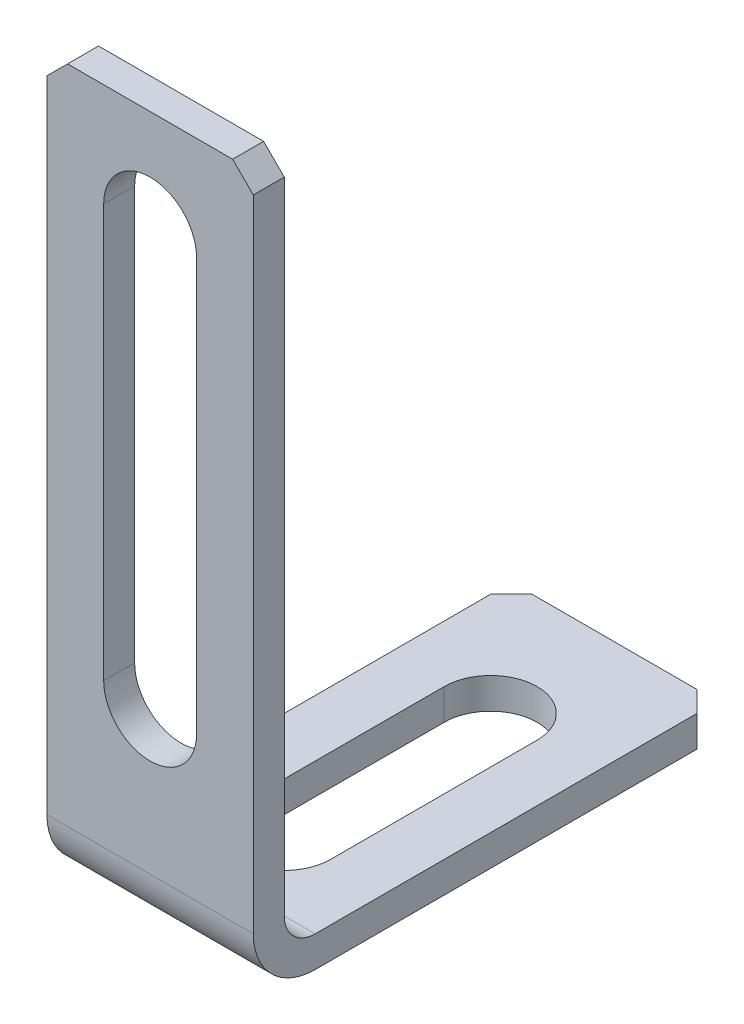
ISO-10303-21;
HEADER;
FILE_DESCRIPTION(('STEP AP214'),'2;1');
FILE_NAME('part.step','',(''),(''),'','','');
FILE_SCHEMA(('AUTOMOTIVE_DESIGN { 1 0 10303 214 1 1 1 1 }'));
ENDSEC;
DATA;
#1=APPLICATION_CONTEXT('core data for automotive mechanical design processes');
#2=APPLICATION_PROTOCOL_DEFINITION('international standard','automotive_design',2000,#1);
#3=PRODUCT_CONTEXT('',#1,'mechanical');
#4=PRODUCT('Part','Part','',(#3));
#5=PRODUCT_RELATED_PRODUCT_CATEGORY('part','',(#4));
#6=PRODUCT_DEFINITION_FORMATION('','',#4);
#7=PRODUCT_DEFINITION_CONTEXT('part definition',#1,'design');
#8=PRODUCT_DEFINITION('design','',#6,#7);
#9=PRODUCT_DEFINITION_SHAPE('','',#8);
#10=(LENGTH_UNIT() NAMED_UNIT(*) SI_UNIT(.MILLI.,.METRE.));
#11=(NAMED_UNIT(*) PLANE_ANGLE_UNIT() SI_UNIT($,.RADIAN.));
#12=(NAMED_UNIT(*) SI_UNIT($,.STERADIAN.) SOLID_ANGLE_UNIT());
#13=UNCERTAINTY_MEASURE_WITH_UNIT(LENGTH_MEASURE(1.E-05),#10,'distance_accuracy_value','');
#14=(GEOMETRIC_REPRESENTATION_CONTEXT(3) GLOBAL_UNCERTAINTY_ASSIGNED_CONTEXT((#13)) GLOBAL_UNIT_ASSIGNED_CONTEXT((#10,
#11,#12)) REPRESENTATION_CONTEXT('',''));
#15=CARTESIAN_POINT('',(0.,0.,0.));
#16=DIRECTION('',(0.,0.,1.));
#17=DIRECTION('',(1.,0.,0.));
#18=AXIS2_PLACEMENT_3D('',#15,#16,#17);
#19=CARTESIAN_POINT('',(0.,70.,-45.));
#20=DIRECTION('',(0.,1.,0.));
#21=DIRECTION('',(0.,0.,1.));
#22=AXIS2_PLACEMENT_3D('',#19,#20,#21);
#23=PLANE('',#22);
#24=DIRECTION('',(-1.,0.,0.));
#25=VECTOR('',#24,1.);
#26=CARTESIAN_POINT('',(20.,70.,-3.));
#27=LINE('',#26,#25);
#28=CARTESIAN_POINT('',(18.,70.,-3.));
#29=VERTEX_POINT('',#28);
#30=CARTESIAN_POINT('',(1.99999999999998,70.,-3.));
#31=VERTEX_POINT('',#30);
#32=EDGE_CURVE('E253',#29,#31,#27,.T.);
#33=ORIENTED_EDGE('',*,*,#32,.T.);
#34=DIRECTION('',(0.,0.,1.));
#35=VECTOR('',#34,1.);
#36=CARTESIAN_POINT('',(1.99999999999998,70.,0.));
#37=LINE('',#36,#35);
#38=CARTESIAN_POINT('',(1.99999999999998,70.,0.));
#39=VERTEX_POINT('',#38);
#40=EDGE_CURVE('E275',#31,#39,#37,.T.);
#41=ORIENTED_EDGE('',*,*,#40,.T.);
#42=DIRECTION('',(1.,0.,0.));
#43=VECTOR('',#42,1.);
#44=CARTESIAN_POINT('',(0.,70.,0.));
#45=LINE('',#44,#43);
#46=CARTESIAN_POINT('',(18.,70.,0.));
#47=VERTEX_POINT('',#46);
#48=EDGE_CURVE('E265',#39,#47,#45,.T.);
#49=ORIENTED_EDGE('',*,*,#48,.T.);
#50=DIRECTION('',(0.,0.,-1.));
#51=VECTOR('',#50,1.);
#52=CARTESIAN_POINT('',(18.,70.,-45.));
#53=LINE('',#52,#51);
#54=EDGE_CURVE('E271',#47,#29,#53,.T.);
#55=ORIENTED_EDGE('',*,*,#54,.T.);
#56=EDGE_LOOP('',(#33,#41,#49,#55));
#57=FACE_BOUND('',#56,.T.);
#58=ADVANCED_FACE('F32',(#57),#23,.T.);
#59=CARTESIAN_POINT('',(0.,0.,-45.));
#60=DIRECTION('',(0.,0.,-1.));
#61=DIRECTION('',(-1.,0.,0.));
#62=AXIS2_PLACEMENT_3D('',#59,#60,#61);
#63=PLANE('',#62);
#64=DIRECTION('',(1.,0.,0.));
#65=VECTOR('',#64,1.);
#66=CARTESIAN_POINT('',(0.,0.,-45.));
#67=LINE('',#66,#65);
#68=CARTESIAN_POINT('',(1.99999999999998,0.,-45.));
#69=VERTEX_POINT('',#68);
#70=CARTESIAN_POINT('',(18.,0.,-45.));
#71=VERTEX_POINT('',#70);
#72=EDGE_CURVE('E268',#69,#71,#67,.T.);
#73=ORIENTED_EDGE('',*,*,#72,.F.);
#74=DIRECTION('',(0.,1.,0.));
#75=VECTOR('',#74,1.);
#76=CARTESIAN_POINT('',(1.99999999999998,3.,-45.));
#77=LINE('',#76,#75);
#78=CARTESIAN_POINT('',(1.99999999999998,3.,-45.));
#79=VERTEX_POINT('',#78);
#80=EDGE_CURVE('E295',#69,#79,#77,.T.);
#81=ORIENTED_EDGE('',*,*,#80,.T.);
#82=DIRECTION('',(-1.,0.,0.));
#83=VECTOR('',#82,1.);
#84=CARTESIAN_POINT('',(20.,3.,-45.));
#85=LINE('',#84,#83);
#86=CARTESIAN_POINT('',(18.,3.,-45.));
#87=VERTEX_POINT('',#86);
#88=EDGE_CURVE('E249',#87,#79,#85,.T.);
#89=ORIENTED_EDGE('',*,*,#88,.F.);
#90=DIRECTION('',(0.,-1.,0.));
#91=VECTOR('',#90,1.);
#92=CARTESIAN_POINT('',(18.,0.,-45.));
#93=LINE('',#92,#91);
#94=EDGE_CURVE('E293',#87,#71,#93,.T.);
#95=ORIENTED_EDGE('',*,*,#94,.T.);
#96=EDGE_LOOP('',(#73,#81,#89,#95));
#97=FACE_BOUND('',#96,.T.);
#98=ADVANCED_FACE('F355',(#97),#63,.T.);
#99=CARTESIAN_POINT('',(0.,0.,0.));
#100=DIRECTION('',(0.,-1.,0.));
#101=DIRECTION('',(0.,0.,-1.));
#102=AXIS2_PLACEMENT_3D('',#99,#100,#101);
#103=PLANE('',#102);
#104=CARTESIAN_POINT('',(10.,0.,-33.));
#105=DIRECTION('',(0.,1.,0.));
#106=DIRECTION('',(0.,0.,1.));
#107=AXIS2_PLACEMENT_3D('',#104,#105,#106);
#108=CIRCLE('',#107,4.5);
#109=CARTESIAN_POINT('',(14.5,0.,-33.));
#110=VERTEX_POINT('',#109);
#111=CARTESIAN_POINT('',(5.5,0.,-33.));
#112=VERTEX_POINT('',#111);
#113=EDGE_CURVE('E211',#110,#112,#108,.T.);
#114=ORIENTED_EDGE('',*,*,#113,.T.);
#115=DIRECTION('',(0.,0.,1.));
#116=VECTOR('',#115,1.);
#117=CARTESIAN_POINT('',(5.5,0.,-33.));
#118=LINE('',#117,#116);
#119=CARTESIAN_POINT('',(5.5,0.,-13.));
#120=VERTEX_POINT('',#119);
#121=EDGE_CURVE('E214',#112,#120,#118,.T.);
#122=ORIENTED_EDGE('',*,*,#121,.T.);
#123=CARTESIAN_POINT('',(10.,0.,-13.));
#124=DIRECTION('',(0.,1.,0.));
#125=DIRECTION('',(0.,0.,1.));
#126=AXIS2_PLACEMENT_3D('',#123,#124,#125);
#127=CIRCLE('',#126,4.5);
#128=CARTESIAN_POINT('',(14.5,0.,-13.));
#129=VERTEX_POINT('',#128);
#130=EDGE_CURVE('E218',#120,#129,#127,.T.);
#131=ORIENTED_EDGE('',*,*,#130,.T.);
#132=DIRECTION('',(0.,0.,-1.));
#133=VECTOR('',#132,1.);
#134=CARTESIAN_POINT('',(14.5,0.,-13.));
#135=LINE('',#134,#133);
#136=EDGE_CURVE('E221',#129,#110,#135,.T.);
#137=ORIENTED_EDGE('',*,*,#136,.T.);
#138=EDGE_LOOP('',(#114,#122,#131,#137));
#139=FACE_BOUND('',#138,.T.);
#140=DIRECTION('',(0.,0.,-1.));
#141=VECTOR('',#140,1.);
#142=CARTESIAN_POINT('',(20.,0.,0.));
#143=LINE('',#142,#141);
#144=CARTESIAN_POINT('',(20.,0.,-6.));
#145=VERTEX_POINT('',#144);
#146=CARTESIAN_POINT('',(20.,0.,-43.));
#147=VERTEX_POINT('',#146);
#148=EDGE_CURVE('E263',#145,#147,#143,.T.);
#149=ORIENTED_EDGE('',*,*,#148,.F.);
#150=DIRECTION('',(1.,0.,0.));
#151=VECTOR('',#150,1.);
#152=CARTESIAN_POINT('',(0.,0.,-6.));
#153=LINE('',#152,#151);
#154=CARTESIAN_POINT('',(0.,0.,-6.));
#155=VERTEX_POINT('',#154);
#156=EDGE_CURVE('E40',#145,#155,#153,.F.);
#157=ORIENTED_EDGE('',*,*,#156,.T.);
#158=DIRECTION('',(0.,0.,-1.));
#159=VECTOR('',#158,1.);
#160=CARTESIAN_POINT('',(0.,0.,0.));
#161=LINE('',#160,#159);
#162=CARTESIAN_POINT('',(0.,0.,-43.));
#163=VERTEX_POINT('',#162);
#164=EDGE_CURVE('E262',#155,#163,#161,.T.);
#165=ORIENTED_EDGE('',*,*,#164,.T.);
#166=DIRECTION('',(0.707106781186544,0.,-0.707106781186551));
#167=VECTOR('',#166,1.);
#168=CARTESIAN_POINT('',(-21.5,0.,-21.4999999999998));
#169=LINE('',#168,#167);
#170=EDGE_CURVE('E305',#163,#69,#169,.T.);
#171=ORIENTED_EDGE('',*,*,#170,.T.);
#172=ORIENTED_EDGE('',*,*,#72,.T.);
#173=DIRECTION('',(-0.70710678118655,0.,-0.707106781186545));
#174=VECTOR('',#173,1.);
#175=CARTESIAN_POINT('',(31.4999999999999,0.,-31.5000000000001));
#176=LINE('',#175,#174);
#177=EDGE_CURVE('E302',#71,#147,#176,.F.);
#178=ORIENTED_EDGE('',*,*,#177,.T.);
#179=EDGE_LOOP('',(#149,#157,#165,#171,#172,#178));
#180=FACE_BOUND('',#179,.T.);
#181=ADVANCED_FACE('F360',(#139,#180),#103,.T.);
#182=CARTESIAN_POINT('',(0.,70.,0.));
#183=DIRECTION('',(0.,0.,1.));
#184=DIRECTION('',(1.,0.,0.));
#185=AXIS2_PLACEMENT_3D('',#182,#183,#184);
#186=PLANE('',#185);
#187=CARTESIAN_POINT('',(10.,60.,0.));
#188=DIRECTION('',(0.,0.,-1.));
#189=DIRECTION('',(-1.,0.,0.));
#190=AXIS2_PLACEMENT_3D('',#187,#188,#189);
#191=CIRCLE('',#190,4.5);
#192=CARTESIAN_POINT('',(5.5,60.,0.));
#193=VERTEX_POINT('',#192);
#194=CARTESIAN_POINT('',(14.5,60.,0.));
#195=VERTEX_POINT('',#194);
#196=EDGE_CURVE('E171',#193,#195,#191,.T.);
#197=ORIENTED_EDGE('',*,*,#196,.T.);
#198=DIRECTION('',(0.,-1.,0.));
#199=VECTOR('',#198,1.);
#200=CARTESIAN_POINT('',(14.5,60.,0.));
#201=LINE('',#200,#199);
#202=CARTESIAN_POINT('',(14.5,20.,0.));
#203=VERTEX_POINT('',#202);
#204=EDGE_CURVE('E183',#195,#203,#201,.T.);
#205=ORIENTED_EDGE('',*,*,#204,.T.);
#206=CARTESIAN_POINT('',(10.,20.,0.));
#207=DIRECTION('',(0.,0.,-1.));
#208=DIRECTION('',(-1.,0.,0.));
#209=AXIS2_PLACEMENT_3D('',#206,#207,#208);
#210=CIRCLE('',#209,4.5);
#211=CARTESIAN_POINT('',(5.5,20.,0.));
#212=VERTEX_POINT('',#211);
#213=EDGE_CURVE('E187',#203,#212,#210,.T.);
#214=ORIENTED_EDGE('',*,*,#213,.T.);
#215=DIRECTION('',(0.,1.,0.));
#216=VECTOR('',#215,1.);
#217=CARTESIAN_POINT('',(5.5,20.,0.));
#218=LINE('',#217,#216);
#219=EDGE_CURVE('E179',#212,#193,#218,.T.);
#220=ORIENTED_EDGE('',*,*,#219,.T.);
#221=EDGE_LOOP('',(#197,#205,#214,#220));
#222=FACE_BOUND('',#221,.T.);
#223=DIRECTION('',(0.,-1.,0.));
#224=VECTOR('',#223,1.);
#225=CARTESIAN_POINT('',(0.,70.,0.));
#226=LINE('',#225,#224);
#227=CARTESIAN_POINT('',(0.,68.,0.));
#228=VERTEX_POINT('',#227);
#229=CARTESIAN_POINT('',(0.,6.00000000000001,0.));
#230=VERTEX_POINT('',#229);
#231=EDGE_CURVE('E259',#228,#230,#226,.T.);
#232=ORIENTED_EDGE('',*,*,#231,.T.);
#233=DIRECTION('',(1.,0.,0.));
#234=VECTOR('',#233,1.);
#235=CARTESIAN_POINT('',(0.,6.00000000000001,0.));
#236=LINE('',#235,#234);
#237=CARTESIAN_POINT('',(20.,6.00000000000001,0.));
#238=VERTEX_POINT('',#237);
#239=EDGE_CURVE('E322',#230,#238,#236,.T.);
#240=ORIENTED_EDGE('',*,*,#239,.T.);
#241=DIRECTION('',(0.,-1.,0.));
#242=VECTOR('',#241,1.);
#243=CARTESIAN_POINT('',(20.,70.,0.));
#244=LINE('',#243,#242);
#245=CARTESIAN_POINT('',(20.,68.,0.));
#246=VERTEX_POINT('',#245);
#247=EDGE_CURVE('E256',#246,#238,#244,.T.);
#248=ORIENTED_EDGE('',*,*,#247,.F.);
#249=DIRECTION('',(0.707106781186555,-0.70710678118654,0.));
#250=VECTOR('',#249,1.);
#251=CARTESIAN_POINT('',(8.9999999999998,79.,0.));
#252=LINE('',#251,#250);
#253=EDGE_CURVE('E278',#246,#47,#252,.F.);
#254=ORIENTED_EDGE('',*,*,#253,.T.);
#255=ORIENTED_EDGE('',*,*,#48,.F.);
#256=DIRECTION('',(-0.707106781186544,-0.707106781186551,0.));
#257=VECTOR('',#256,1.);
#258=CARTESIAN_POINT('',(1.,69.,0.));
#259=LINE('',#258,#257);
#260=EDGE_CURVE('E280',#39,#228,#259,.T.);
#261=ORIENTED_EDGE('',*,*,#260,.T.);
#262=EDGE_LOOP('',(#232,#240,#248,#254,#255,#261));
#263=FACE_BOUND('',#262,.T.);
#264=ADVANCED_FACE('F189',(#222,#263),#186,.T.);
#265=CARTESIAN_POINT('',(0.,0.,0.));
#266=DIRECTION('',(1.,0.,0.));
#267=DIRECTION('',(0.,0.,-1.));
#268=AXIS2_PLACEMENT_3D('',#265,#266,#267);
#269=PLANE('',#268);
#270=ORIENTED_EDGE('',*,*,#164,.F.);
#271=CARTESIAN_POINT('',(0.,6.00000000000001,-6.));
#272=DIRECTION('',(1.,0.,0.));
#273=DIRECTION('',(0.,0.,-1.));
#274=AXIS2_PLACEMENT_3D('',#271,#272,#273);
#275=CIRCLE('',#274,6.);
#276=EDGE_CURVE('E11',#155,#230,#275,.F.);
#277=ORIENTED_EDGE('',*,*,#276,.T.);
#278=ORIENTED_EDGE('',*,*,#231,.F.);
#279=DIRECTION('',(0.,0.,-1.));
#280=VECTOR('',#279,1.);
#281=CARTESIAN_POINT('',(0.,68.,-3.));
#282=LINE('',#281,#280);
#283=CARTESIAN_POINT('',(0.,68.,-3.));
#284=VERTEX_POINT('',#283);
#285=EDGE_CURVE('E285',#228,#284,#282,.T.);
#286=ORIENTED_EDGE('',*,*,#285,.T.);
#287=DIRECTION('',(0.,1.,0.));
#288=VECTOR('',#287,1.);
#289=CARTESIAN_POINT('',(0.,3.,-3.));
#290=LINE('',#289,#288);
#291=CARTESIAN_POINT('',(0.,6.,-3.));
#292=VERTEX_POINT('',#291);
#293=EDGE_CURVE('E247',#292,#284,#290,.T.);
#294=ORIENTED_EDGE('',*,*,#293,.F.);
#295=CARTESIAN_POINT('',(0.,6.,-6.));
#296=DIRECTION('',(1.,0.,0.));
#297=DIRECTION('',(0.,0.,-1.));
#298=AXIS2_PLACEMENT_3D('',#295,#296,#297);
#299=CIRCLE('',#298,3.);
#300=CARTESIAN_POINT('',(0.,3.,-6.));
#301=VERTEX_POINT('',#300);
#302=EDGE_CURVE('E318',#292,#301,#299,.T.);
#303=ORIENTED_EDGE('',*,*,#302,.T.);
#304=DIRECTION('',(0.,0.,1.));
#305=VECTOR('',#304,1.);
#306=CARTESIAN_POINT('',(0.,3.,-45.));
#307=LINE('',#306,#305);
#308=CARTESIAN_POINT('',(0.,3.,-43.));
#309=VERTEX_POINT('',#308);
#310=EDGE_CURVE('E236',#309,#301,#307,.T.);
#311=ORIENTED_EDGE('',*,*,#310,.F.);
#312=DIRECTION('',(0.,-1.,0.));
#313=VECTOR('',#312,1.);
#314=CARTESIAN_POINT('',(0.,0.,-43.));
#315=LINE('',#314,#313);
#316=EDGE_CURVE('E282',#309,#163,#315,.T.);
#317=ORIENTED_EDGE('',*,*,#316,.T.);
#318=EDGE_LOOP('',(#270,#277,#278,#286,#294,#303,#311,#317));
#319=FACE_BOUND('',#318,.T.);
#320=ADVANCED_FACE('F346',(#319),#269,.F.);
#321=CARTESIAN_POINT('',(20.,0.,0.));
#322=DIRECTION('',(1.,0.,0.));
#323=DIRECTION('',(0.,0.,-1.));
#324=AXIS2_PLACEMENT_3D('',#321,#322,#323);
#325=PLANE('',#324);
#326=ORIENTED_EDGE('',*,*,#247,.T.);
#327=CARTESIAN_POINT('',(20.,6.00000000000001,-6.));
#328=DIRECTION('',(1.,0.,0.));
#329=DIRECTION('',(0.,0.,-1.));
#330=AXIS2_PLACEMENT_3D('',#327,#328,#329);
#331=CIRCLE('',#330,6.);
#332=EDGE_CURVE('E54',#238,#145,#331,.T.);
#333=ORIENTED_EDGE('',*,*,#332,.T.);
#334=ORIENTED_EDGE('',*,*,#148,.T.);
#335=DIRECTION('',(0.,1.,0.));
#336=VECTOR('',#335,1.);
#337=CARTESIAN_POINT('',(20.,0.,-43.));
#338=LINE('',#337,#336);
#339=CARTESIAN_POINT('',(20.,3.,-43.));
#340=VERTEX_POINT('',#339);
#341=EDGE_CURVE('E310',#147,#340,#338,.T.);
#342=ORIENTED_EDGE('',*,*,#341,.T.);
#343=DIRECTION('',(0.,0.,1.));
#344=VECTOR('',#343,1.);
#345=CARTESIAN_POINT('',(20.,3.,-45.));
#346=LINE('',#345,#344);
#347=CARTESIAN_POINT('',(20.,3.,-6.));
#348=VERTEX_POINT('',#347);
#349=EDGE_CURVE('E243',#340,#348,#346,.T.);
#350=ORIENTED_EDGE('',*,*,#349,.T.);
#351=CARTESIAN_POINT('',(20.,6.,-6.));
#352=DIRECTION('',(1.,0.,0.));
#353=DIRECTION('',(0.,0.,-1.));
#354=AXIS2_PLACEMENT_3D('',#351,#352,#353);
#355=CIRCLE('',#354,3.);
#356=CARTESIAN_POINT('',(20.,6.,-3.));
#357=VERTEX_POINT('',#356);
#358=EDGE_CURVE('E320',#348,#357,#355,.F.);
#359=ORIENTED_EDGE('',*,*,#358,.T.);
#360=DIRECTION('',(0.,1.,0.));
#361=VECTOR('',#360,1.);
#362=CARTESIAN_POINT('',(20.,3.,-3.));
#363=LINE('',#362,#361);
#364=CARTESIAN_POINT('',(20.,68.,-3.));
#365=VERTEX_POINT('',#364);
#366=EDGE_CURVE('E246',#357,#365,#363,.T.);
#367=ORIENTED_EDGE('',*,*,#366,.T.);
#368=DIRECTION('',(0.,0.,1.));
#369=VECTOR('',#368,1.);
#370=CARTESIAN_POINT('',(20.,68.,0.));
#371=LINE('',#370,#369);
#372=EDGE_CURVE('E307',#365,#246,#371,.T.);
#373=ORIENTED_EDGE('',*,*,#372,.T.);
#374=EDGE_LOOP('',(#326,#333,#334,#342,#350,#359,#367,#373));
#375=FACE_BOUND('',#374,.T.);
#376=ADVANCED_FACE('F330',(#375),#325,.T.);
#377=CARTESIAN_POINT('',(20.,3.,-3.));
#378=DIRECTION('',(0.,0.,1.));
#379=DIRECTION('',(1.,0.,0.));
#380=AXIS2_PLACEMENT_3D('',#377,#378,#379);
#381=PLANE('',#380);
#382=DIRECTION('',(0.,-1.,0.));
#383=VECTOR('',#382,1.);
#384=CARTESIAN_POINT('',(14.5,60.,-3.));
#385=LINE('',#384,#383);
#386=CARTESIAN_POINT('',(14.5,60.,-3.));
#387=VERTEX_POINT('',#386);
#388=CARTESIAN_POINT('',(14.5,20.,-3.));
#389=VERTEX_POINT('',#388);
#390=EDGE_CURVE('E201',#387,#389,#385,.T.);
#391=ORIENTED_EDGE('',*,*,#390,.F.);
#392=CARTESIAN_POINT('',(10.,60.,-3.));
#393=DIRECTION('',(0.,0.,-1.));
#394=DIRECTION('',(-1.,0.,0.));
#395=AXIS2_PLACEMENT_3D('',#392,#393,#394);
#396=CIRCLE('',#395,4.5);
#397=CARTESIAN_POINT('',(5.5,60.,-3.));
#398=VERTEX_POINT('',#397);
#399=EDGE_CURVE('E174',#398,#387,#396,.T.);
#400=ORIENTED_EDGE('',*,*,#399,.F.);
#401=DIRECTION('',(0.,1.,0.));
#402=VECTOR('',#401,1.);
#403=CARTESIAN_POINT('',(5.5,20.,-3.));
#404=LINE('',#403,#402);
#405=CARTESIAN_POINT('',(5.5,20.,-3.));
#406=VERTEX_POINT('',#405);
#407=EDGE_CURVE('E192',#406,#398,#404,.T.);
#408=ORIENTED_EDGE('',*,*,#407,.F.);
#409=CARTESIAN_POINT('',(10.,20.,-3.));
#410=DIRECTION('',(0.,0.,-1.));
#411=DIRECTION('',(-1.,0.,0.));
#412=AXIS2_PLACEMENT_3D('',#409,#410,#411);
#413=CIRCLE('',#412,4.5);
#414=EDGE_CURVE('E195',#389,#406,#413,.T.);
#415=ORIENTED_EDGE('',*,*,#414,.F.);
#416=EDGE_LOOP('',(#391,#400,#408,#415));
#417=FACE_BOUND('',#416,.T.);
#418=ORIENTED_EDGE('',*,*,#366,.F.);
#419=DIRECTION('',(-1.,0.,0.));
#420=VECTOR('',#419,1.);
#421=CARTESIAN_POINT('',(0.,6.,-3.));
#422=LINE('',#421,#420);
#423=EDGE_CURVE('E313',#357,#292,#422,.T.);
#424=ORIENTED_EDGE('',*,*,#423,.T.);
#425=ORIENTED_EDGE('',*,*,#293,.T.);
#426=DIRECTION('',(0.707106781186544,0.707106781186551,0.));
#427=VECTOR('',#426,1.);
#428=CARTESIAN_POINT('',(1.99999999999998,70.,-3.));
#429=LINE('',#428,#427);
#430=EDGE_CURVE('E291',#284,#31,#429,.T.);
#431=ORIENTED_EDGE('',*,*,#430,.T.);
#432=ORIENTED_EDGE('',*,*,#32,.F.);
#433=DIRECTION('',(-0.707106781186555,0.70710678118654,0.));
#434=VECTOR('',#433,1.);
#435=CARTESIAN_POINT('',(20.,68.,-3.));
#436=LINE('',#435,#434);
#437=EDGE_CURVE('E288',#29,#365,#436,.F.);
#438=ORIENTED_EDGE('',*,*,#437,.T.);
#439=EDGE_LOOP('',(#418,#424,#425,#431,#432,#438));
#440=FACE_BOUND('',#439,.T.);
#441=ADVANCED_FACE('F424',(#417,#440),#381,.F.);
#442=CARTESIAN_POINT('',(20.,3.,-45.));
#443=DIRECTION('',(0.,-1.,0.));
#444=DIRECTION('',(0.,0.,-1.));
#445=AXIS2_PLACEMENT_3D('',#442,#443,#444);
#446=PLANE('',#445);
#447=DIRECTION('',(0.,0.,1.));
#448=VECTOR('',#447,1.);
#449=CARTESIAN_POINT('',(5.5,3.,-33.));
#450=LINE('',#449,#448);
#451=CARTESIAN_POINT('',(5.5,3.,-33.));
#452=VERTEX_POINT('',#451);
#453=CARTESIAN_POINT('',(5.5,3.,-13.));
#454=VERTEX_POINT('',#453);
#455=EDGE_CURVE('E226',#452,#454,#450,.T.);
#456=ORIENTED_EDGE('',*,*,#455,.F.);
#457=CARTESIAN_POINT('',(10.,3.,-33.));
#458=DIRECTION('',(0.,1.,0.));
#459=DIRECTION('',(0.,0.,1.));
#460=AXIS2_PLACEMENT_3D('',#457,#458,#459);
#461=CIRCLE('',#460,4.5);
#462=CARTESIAN_POINT('',(14.5,3.,-33.));
#463=VERTEX_POINT('',#462);
#464=EDGE_CURVE('E207',#463,#452,#461,.T.);
#465=ORIENTED_EDGE('',*,*,#464,.F.);
#466=DIRECTION('',(0.,0.,-1.));
#467=VECTOR('',#466,1.);
#468=CARTESIAN_POINT('',(14.5,3.,-13.));
#469=LINE('',#468,#467);
#470=CARTESIAN_POINT('',(14.5,3.,-13.));
#471=VERTEX_POINT('',#470);
#472=EDGE_CURVE('E215',#471,#463,#469,.T.);
#473=ORIENTED_EDGE('',*,*,#472,.F.);
#474=CARTESIAN_POINT('',(10.,3.,-13.));
#475=DIRECTION('',(0.,1.,0.));
#476=DIRECTION('',(0.,0.,1.));
#477=AXIS2_PLACEMENT_3D('',#474,#475,#476);
#478=CIRCLE('',#477,4.5);
#479=EDGE_CURVE('E229',#454,#471,#478,.T.);
#480=ORIENTED_EDGE('',*,*,#479,.F.);
#481=EDGE_LOOP('',(#456,#465,#473,#480));
#482=FACE_BOUND('',#481,.T.);
#483=ORIENTED_EDGE('',*,*,#310,.T.);
#484=DIRECTION('',(-1.,0.,0.));
#485=VECTOR('',#484,1.);
#486=CARTESIAN_POINT('',(20.,3.,-6.));
#487=LINE('',#486,#485);
#488=EDGE_CURVE('E316',#301,#348,#487,.F.);
#489=ORIENTED_EDGE('',*,*,#488,.T.);
#490=ORIENTED_EDGE('',*,*,#349,.F.);
#491=DIRECTION('',(0.70710678118655,0.,0.707106781186545));
#492=VECTOR('',#491,1.);
#493=CARTESIAN_POINT('',(20.,3.,-43.));
#494=LINE('',#493,#492);
#495=EDGE_CURVE('E298',#340,#87,#494,.F.);
#496=ORIENTED_EDGE('',*,*,#495,.T.);
#497=ORIENTED_EDGE('',*,*,#88,.T.);
#498=DIRECTION('',(-0.707106781186544,0.,0.707106781186551));
#499=VECTOR('',#498,1.);
#500=CARTESIAN_POINT('',(1.99999999999998,3.,-45.));
#501=LINE('',#500,#499);
#502=EDGE_CURVE('E300',#79,#309,#501,.T.);
#503=ORIENTED_EDGE('',*,*,#502,.T.);
#504=EDGE_LOOP('',(#483,#489,#490,#496,#497,#503));
#505=FACE_BOUND('',#504,.T.);
#506=ADVANCED_FACE('F393',(#482,#505),#446,.F.);
#507=CARTESIAN_POINT('',(10.,0.,-33.));
#508=DIRECTION('',(0.,1.,0.));
#509=DIRECTION('',(0.,0.,1.));
#510=AXIS2_PLACEMENT_3D('',#507,#508,#509);
#511=CYLINDRICAL_SURFACE('',#510,4.5);
#512=ORIENTED_EDGE('',*,*,#464,.T.);
#513=DIRECTION('',(0.,1.,0.));
#514=VECTOR('',#513,1.);
#515=CARTESIAN_POINT('',(5.5,0.,-33.));
#516=LINE('',#515,#514);
#517=EDGE_CURVE('E224',#112,#452,#516,.T.);
#518=ORIENTED_EDGE('',*,*,#517,.F.);
#519=ORIENTED_EDGE('',*,*,#113,.F.);
#520=DIRECTION('',(0.,1.,0.));
#521=VECTOR('',#520,1.);
#522=CARTESIAN_POINT('',(14.5,0.,-33.));
#523=LINE('',#522,#521);
#524=EDGE_CURVE('E234',#110,#463,#523,.T.);
#525=ORIENTED_EDGE('',*,*,#524,.T.);
#526=EDGE_LOOP('',(#512,#518,#519,#525));
#527=FACE_BOUND('',#526,.T.);
#528=ADVANCED_FACE('F440',(#527),#511,.F.);
#529=CARTESIAN_POINT('',(14.5,0.,-13.));
#530=DIRECTION('',(1.,0.,0.));
#531=DIRECTION('',(0.,0.,-1.));
#532=AXIS2_PLACEMENT_3D('',#529,#530,#531);
#533=PLANE('',#532);
#534=ORIENTED_EDGE('',*,*,#472,.T.);
#535=ORIENTED_EDGE('',*,*,#524,.F.);
#536=ORIENTED_EDGE('',*,*,#136,.F.);
#537=DIRECTION('',(0.,1.,0.));
#538=VECTOR('',#537,1.);
#539=CARTESIAN_POINT('',(14.5,0.,-13.));
#540=LINE('',#539,#538);
#541=EDGE_CURVE('E237',#129,#471,#540,.T.);
#542=ORIENTED_EDGE('',*,*,#541,.T.);
#543=EDGE_LOOP('',(#534,#535,#536,#542));
#544=FACE_BOUND('',#543,.T.);
#545=ADVANCED_FACE('F446',(#544),#533,.F.);
#546=CARTESIAN_POINT('',(10.,0.,-13.));
#547=DIRECTION('',(0.,1.,0.));
#548=DIRECTION('',(0.,0.,1.));
#549=AXIS2_PLACEMENT_3D('',#546,#547,#548);
#550=CYLINDRICAL_SURFACE('',#549,4.5);
#551=ORIENTED_EDGE('',*,*,#479,.T.);
#552=ORIENTED_EDGE('',*,*,#541,.F.);
#553=ORIENTED_EDGE('',*,*,#130,.F.);
#554=DIRECTION('',(0.,1.,0.));
#555=VECTOR('',#554,1.);
#556=CARTESIAN_POINT('',(5.5,0.,-13.));
#557=LINE('',#556,#555);
#558=EDGE_CURVE('E239',#120,#454,#557,.T.);
#559=ORIENTED_EDGE('',*,*,#558,.T.);
#560=EDGE_LOOP('',(#551,#552,#553,#559));
#561=FACE_BOUND('',#560,.T.);
#562=ADVANCED_FACE('F454',(#561),#550,.F.);
#563=CARTESIAN_POINT('',(5.5,0.,-33.));
#564=DIRECTION('',(-1.,0.,0.));
#565=DIRECTION('',(0.,0.,1.));
#566=AXIS2_PLACEMENT_3D('',#563,#564,#565);
#567=PLANE('',#566);
#568=ORIENTED_EDGE('',*,*,#455,.T.);
#569=ORIENTED_EDGE('',*,*,#558,.F.);
#570=ORIENTED_EDGE('',*,*,#121,.F.);
#571=ORIENTED_EDGE('',*,*,#517,.T.);
#572=EDGE_LOOP('',(#568,#569,#570,#571));
#573=FACE_BOUND('',#572,.T.);
#574=ADVANCED_FACE('F462',(#573),#567,.F.);
#575=CARTESIAN_POINT('',(10.,60.,0.));
#576=DIRECTION('',(0.,0.,-1.));
#577=DIRECTION('',(-1.,0.,0.));
#578=AXIS2_PLACEMENT_3D('',#575,#576,#577);
#579=CYLINDRICAL_SURFACE('',#578,4.5);
#580=ORIENTED_EDGE('',*,*,#399,.T.);
#581=DIRECTION('',(0.,0.,-1.));
#582=VECTOR('',#581,1.);
#583=CARTESIAN_POINT('',(14.5,60.,0.));
#584=LINE('',#583,#582);
#585=EDGE_CURVE('E167',#195,#387,#584,.T.);
#586=ORIENTED_EDGE('',*,*,#585,.F.);
#587=ORIENTED_EDGE('',*,*,#196,.F.);
#588=DIRECTION('',(0.,0.,-1.));
#589=VECTOR('',#588,1.);
#590=CARTESIAN_POINT('',(5.5,60.,0.));
#591=LINE('',#590,#589);
#592=EDGE_CURVE('E205',#193,#398,#591,.T.);
#593=ORIENTED_EDGE('',*,*,#592,.T.);
#594=EDGE_LOOP('',(#580,#586,#587,#593));
#595=FACE_BOUND('',#594,.T.);
#596=ADVANCED_FACE('F169',(#595),#579,.F.);
#597=CARTESIAN_POINT('',(5.5,20.,0.));
#598=DIRECTION('',(-1.,0.,0.));
#599=DIRECTION('',(0.,0.,1.));
#600=AXIS2_PLACEMENT_3D('',#597,#598,#599);
#601=PLANE('',#600);
#602=ORIENTED_EDGE('',*,*,#407,.T.);
#603=ORIENTED_EDGE('',*,*,#592,.F.);
#604=ORIENTED_EDGE('',*,*,#219,.F.);
#605=DIRECTION('',(0.,0.,-1.));
#606=VECTOR('',#605,1.);
#607=CARTESIAN_POINT('',(5.5,20.,0.));
#608=LINE('',#607,#606);
#609=EDGE_CURVE('E208',#212,#406,#608,.T.);
#610=ORIENTED_EDGE('',*,*,#609,.T.);
#611=EDGE_LOOP('',(#602,#603,#604,#610));
#612=FACE_BOUND('',#611,.T.);
#613=ADVANCED_FACE('F477',(#612),#601,.F.);
#614=CARTESIAN_POINT('',(10.,20.,0.));
#615=DIRECTION('',(0.,0.,-1.));
#616=DIRECTION('',(-1.,0.,0.));
#617=AXIS2_PLACEMENT_3D('',#614,#615,#616);
#618=CYLINDRICAL_SURFACE('',#617,4.5);
#619=ORIENTED_EDGE('',*,*,#414,.T.);
#620=ORIENTED_EDGE('',*,*,#609,.F.);
#621=ORIENTED_EDGE('',*,*,#213,.F.);
#622=DIRECTION('',(0.,0.,-1.));
#623=VECTOR('',#622,1.);
#624=CARTESIAN_POINT('',(14.5,20.,0.));
#625=LINE('',#624,#623);
#626=EDGE_CURVE('E178',#203,#389,#625,.T.);
#627=ORIENTED_EDGE('',*,*,#626,.T.);
#628=EDGE_LOOP('',(#619,#620,#621,#627));
#629=FACE_BOUND('',#628,.T.);
#630=ADVANCED_FACE('F484',(#629),#618,.F.);
#631=CARTESIAN_POINT('',(14.5,60.,0.));
#632=DIRECTION('',(1.,0.,0.));
#633=DIRECTION('',(0.,0.,-1.));
#634=AXIS2_PLACEMENT_3D('',#631,#632,#633);
#635=PLANE('',#634);
#636=ORIENTED_EDGE('',*,*,#390,.T.);
#637=ORIENTED_EDGE('',*,*,#626,.F.);
#638=ORIENTED_EDGE('',*,*,#204,.F.);
#639=ORIENTED_EDGE('',*,*,#585,.T.);
#640=EDGE_LOOP('',(#636,#637,#638,#639));
#641=FACE_BOUND('',#640,.T.);
#642=ADVANCED_FACE('F184',(#641),#635,.F.);
#643=CARTESIAN_POINT('',(1.99999999999998,70.,-45.));
#644=DIRECTION('',(-0.707106781186551,0.707106781186544,0.));
#645=DIRECTION('',(0.,0.,-1.));
#646=AXIS2_PLACEMENT_3D('',#643,#644,#645);
#647=PLANE('',#646);
#648=ORIENTED_EDGE('',*,*,#430,.F.);
#649=ORIENTED_EDGE('',*,*,#285,.F.);
#650=ORIENTED_EDGE('',*,*,#260,.F.);
#651=ORIENTED_EDGE('',*,*,#40,.F.);
#652=EDGE_LOOP('',(#648,#649,#650,#651));
#653=FACE_BOUND('',#652,.T.);
#654=ADVANCED_FACE('F343',(#653),#647,.T.);
#655=CARTESIAN_POINT('',(1.99999999999998,0.,-45.));
#656=DIRECTION('',(-0.707106781186551,0.,-0.707106781186544));
#657=DIRECTION('',(0.,-1.,0.));
#658=AXIS2_PLACEMENT_3D('',#655,#656,#657);
#659=PLANE('',#658);
#660=ORIENTED_EDGE('',*,*,#170,.F.);
#661=ORIENTED_EDGE('',*,*,#316,.F.);
#662=ORIENTED_EDGE('',*,*,#502,.F.);
#663=ORIENTED_EDGE('',*,*,#80,.F.);
#664=EDGE_LOOP('',(#660,#661,#662,#663));
#665=FACE_BOUND('',#664,.T.);
#666=ADVANCED_FACE('F368',(#665),#659,.T.);
#667=CARTESIAN_POINT('',(20.,0.,-43.));
#668=DIRECTION('',(-0.707106781186545,0.,0.70710678118655));
#669=DIRECTION('',(0.,1.,0.));
#670=AXIS2_PLACEMENT_3D('',#667,#668,#669);
#671=PLANE('',#670);
#672=ORIENTED_EDGE('',*,*,#177,.F.);
#673=ORIENTED_EDGE('',*,*,#94,.F.);
#674=ORIENTED_EDGE('',*,*,#495,.F.);
#675=ORIENTED_EDGE('',*,*,#341,.F.);
#676=EDGE_LOOP('',(#672,#673,#674,#675));
#677=FACE_BOUND('',#676,.T.);
#678=ADVANCED_FACE('F371',(#677),#671,.F.);
#679=CARTESIAN_POINT('',(20.,68.,0.));
#680=DIRECTION('',(-0.70710678118654,-0.707106781186555,0.));
#681=DIRECTION('',(0.,0.,1.));
#682=AXIS2_PLACEMENT_3D('',#679,#680,#681);
#683=PLANE('',#682);
#684=ORIENTED_EDGE('',*,*,#437,.F.);
#685=ORIENTED_EDGE('',*,*,#54,.F.);
#686=ORIENTED_EDGE('',*,*,#253,.F.);
#687=ORIENTED_EDGE('',*,*,#372,.F.);
#688=EDGE_LOOP('',(#684,#685,#686,#687));
#689=FACE_BOUND('',#688,.T.);
#690=ADVANCED_FACE('F335',(#689),#683,.F.);
#691=CARTESIAN_POINT('',(20.,6.,-6.));
#692=DIRECTION('',(1.,0.,0.));
#693=DIRECTION('',(0.,0.,-1.));
#694=AXIS2_PLACEMENT_3D('',#691,#692,#693);
#695=CYLINDRICAL_SURFACE('',#694,3.);
#696=ORIENTED_EDGE('',*,*,#358,.F.);
#697=ORIENTED_EDGE('',*,*,#488,.F.);
#698=ORIENTED_EDGE('',*,*,#302,.F.);
#699=ORIENTED_EDGE('',*,*,#423,.F.);
#700=EDGE_LOOP('',(#696,#697,#698,#699));
#701=FACE_BOUND('',#700,.T.);
#702=ADVANCED_FACE('F349',(#701),#695,.F.);
#703=CARTESIAN_POINT('',(0.,6.00000000000001,-6.));
#704=DIRECTION('',(1.,0.,0.));
#705=DIRECTION('',(0.,0.,-1.));
#706=AXIS2_PLACEMENT_3D('',#703,#704,#705);
#707=CYLINDRICAL_SURFACE('',#706,6.);
#708=ORIENTED_EDGE('',*,*,#276,.F.);
#709=ORIENTED_EDGE('',*,*,#156,.F.);
#710=ORIENTED_EDGE('',*,*,#332,.F.);
#711=ORIENTED_EDGE('',*,*,#239,.F.);
#712=EDGE_LOOP('',(#708,#709,#710,#711));
#713=FACE_BOUND('',#712,.T.);
#714=ADVANCED_FACE('F34',(#713),#707,.T.);
#715=CLOSED_SHELL('',(#58,#98,#181,#264,#320,#376,#441,#506,#528,#545,#562,#574,#596,#613,#630,
#642,#654,#666,#678,#690,#702,#714));
#716=MANIFOLD_SOLID_BREP('B2',#715);
#717=ADVANCED_BREP_SHAPE_REPRESENTATION('',(#18,#716),#14);
#718=SHAPE_DEFINITION_REPRESENTATION(#9,#717);
ENDSEC;
END-ISO-10303-21;
